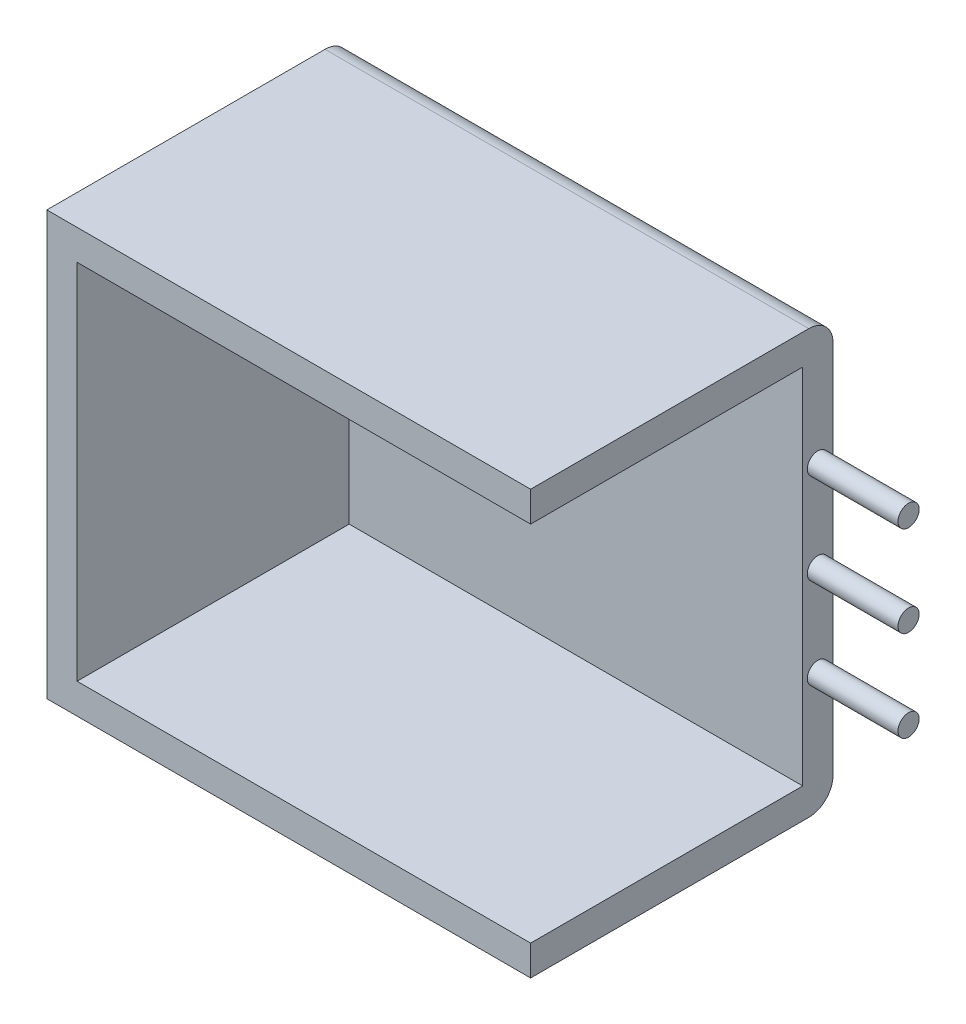
ISO-10303-21;
HEADER;
FILE_DESCRIPTION(('STEP AP214'),'2;1');
FILE_NAME('part.step','',(''),(''),'','','');
FILE_SCHEMA(('AUTOMOTIVE_DESIGN { 1 0 10303 214 1 1 1 1 }'));
ENDSEC;
DATA;
#1=APPLICATION_CONTEXT('core data for automotive mechanical design processes');
#2=APPLICATION_PROTOCOL_DEFINITION('international standard','automotive_design',2000,#1);
#3=PRODUCT_CONTEXT('',#1,'mechanical');
#4=PRODUCT('Part','Part','',(#3));
#5=PRODUCT_RELATED_PRODUCT_CATEGORY('part','',(#4));
#6=PRODUCT_DEFINITION_FORMATION('','',#4);
#7=PRODUCT_DEFINITION_CONTEXT('part definition',#1,'design');
#8=PRODUCT_DEFINITION('design','',#6,#7);
#9=PRODUCT_DEFINITION_SHAPE('','',#8);
#10=(LENGTH_UNIT() NAMED_UNIT(*) SI_UNIT(.MILLI.,.METRE.));
#11=(NAMED_UNIT(*) PLANE_ANGLE_UNIT() SI_UNIT($,.RADIAN.));
#12=(NAMED_UNIT(*) SI_UNIT($,.STERADIAN.) SOLID_ANGLE_UNIT());
#13=UNCERTAINTY_MEASURE_WITH_UNIT(LENGTH_MEASURE(1.E-05),#10,'distance_accuracy_value','');
#14=(GEOMETRIC_REPRESENTATION_CONTEXT(3) GLOBAL_UNCERTAINTY_ASSIGNED_CONTEXT((#13)) GLOBAL_UNIT_ASSIGNED_CONTEXT((#10,
#11,#12)) REPRESENTATION_CONTEXT('',''));
#15=CARTESIAN_POINT('',(0.,0.,0.));
#16=DIRECTION('',(0.,0.,1.));
#17=DIRECTION('',(1.,0.,0.));
#18=AXIS2_PLACEMENT_3D('',#15,#16,#17);
#19=CARTESIAN_POINT('',(0.,-59.9999999999997,10.));
#20=DIRECTION('',(-1.,0.,0.));
#21=DIRECTION('',(0.,0.,1.));
#22=AXIS2_PLACEMENT_3D('',#19,#20,#21);
#23=PLANE('',#22);
#24=CARTESIAN_POINT('',(0.,0.,5.));
#25=DIRECTION('',(-1.,0.,0.));
#26=DIRECTION('',(0.,0.,1.));
#27=AXIS2_PLACEMENT_3D('',#24,#25,#26);
#28=CIRCLE('',#27,3.5);
#29=CARTESIAN_POINT('',(0.,0.,8.5));
#30=VERTEX_POINT('',#29);
#31=EDGE_CURVE('E195',#30,#30,#28,.F.);
#32=ORIENTED_EDGE('',*,*,#31,.F.);
#33=EDGE_LOOP('',(#32));
#34=FACE_BOUND('',#33,.T.);
#35=CARTESIAN_POINT('',(0.,-30.,5.));
#36=DIRECTION('',(-1.,0.,0.));
#37=DIRECTION('',(0.,0.,1.));
#38=AXIS2_PLACEMENT_3D('',#35,#36,#37);
#39=CIRCLE('',#38,3.5);
#40=CARTESIAN_POINT('',(0.,-30.,8.5));
#41=VERTEX_POINT('',#40);
#42=EDGE_CURVE('E192',#41,#41,#39,.F.);
#43=ORIENTED_EDGE('',*,*,#42,.F.);
#44=EDGE_LOOP('',(#43));
#45=FACE_BOUND('',#44,.T.);
#46=CARTESIAN_POINT('',(0.,30.,5.));
#47=DIRECTION('',(-1.,0.,0.));
#48=DIRECTION('',(0.,0.,1.));
#49=AXIS2_PLACEMENT_3D('',#46,#47,#48);
#50=CIRCLE('',#49,3.5);
#51=CARTESIAN_POINT('',(0.,30.,8.5));
#52=VERTEX_POINT('',#51);
#53=EDGE_CURVE('E187',#52,#52,#50,.F.);
#54=ORIENTED_EDGE('',*,*,#53,.F.);
#55=EDGE_LOOP('',(#54));
#56=FACE_BOUND('',#55,.T.);
#57=DIRECTION('',(0.,0.,1.));
#58=VECTOR('',#57,1.);
#59=CARTESIAN_POINT('',(1.94289029309402E-13,-69.9999999999997,0.));
#60=LINE('',#59,#58);
#61=CARTESIAN_POINT('',(1.92819453150425E-13,-69.9999999999997,8.));
#62=VERTEX_POINT('',#61);
#63=CARTESIAN_POINT('',(1.75919327322191E-13,-69.9999999999997,100.));
#64=VERTEX_POINT('',#63);
#65=EDGE_CURVE('E148',#62,#64,#60,.T.);
#66=ORIENTED_EDGE('',*,*,#65,.F.);
#67=CARTESIAN_POINT('',(0.,-61.9999999999997,8.));
#68=DIRECTION('',(-1.,0.,0.));
#69=DIRECTION('',(0.,0.,1.));
#70=AXIS2_PLACEMENT_3D('',#67,#68,#69);
#71=CIRCLE('',#70,8.);
#72=CARTESIAN_POINT('',(0.,-61.9999999999997,0.));
#73=VERTEX_POINT('',#72);
#74=EDGE_CURVE('E203',#62,#73,#71,.F.);
#75=ORIENTED_EDGE('',*,*,#74,.T.);
#76=DIRECTION('',(0.,1.,0.));
#77=VECTOR('',#76,1.);
#78=CARTESIAN_POINT('',(0.,-59.9999999999997,0.));
#79=LINE('',#78,#77);
#80=CARTESIAN_POINT('',(0.,61.9999999999999,0.));
#81=VERTEX_POINT('',#80);
#82=EDGE_CURVE('E175',#73,#81,#79,.T.);
#83=ORIENTED_EDGE('',*,*,#82,.T.);
#84=CARTESIAN_POINT('',(0.,61.9999999999999,8.));
#85=DIRECTION('',(-1.,0.,0.));
#86=DIRECTION('',(0.,0.,1.));
#87=AXIS2_PLACEMENT_3D('',#84,#85,#86);
#88=CIRCLE('',#87,8.);
#89=CARTESIAN_POINT('',(0.,69.9999999999999,8.));
#90=VERTEX_POINT('',#89);
#91=EDGE_CURVE('E201',#81,#90,#88,.F.);
#92=ORIENTED_EDGE('',*,*,#91,.T.);
#93=DIRECTION('',(0.,0.,-1.));
#94=VECTOR('',#93,1.);
#95=CARTESIAN_POINT('',(0.,69.9999999999999,0.));
#96=LINE('',#95,#94);
#97=CARTESIAN_POINT('',(0.,69.9999999999999,100.));
#98=VERTEX_POINT('',#97);
#99=EDGE_CURVE('E137',#98,#90,#96,.T.);
#100=ORIENTED_EDGE('',*,*,#99,.F.);
#101=DIRECTION('',(0.,-1.,0.));
#102=VECTOR('',#101,1.);
#103=CARTESIAN_POINT('',(0.,69.9999999999999,100.));
#104=LINE('',#103,#102);
#105=CARTESIAN_POINT('',(0.,59.9999999999999,100.));
#106=VERTEX_POINT('',#105);
#107=EDGE_CURVE('E135',#98,#106,#104,.T.);
#108=ORIENTED_EDGE('',*,*,#107,.T.);
#109=DIRECTION('',(0.,0.,-1.));
#110=VECTOR('',#109,1.);
#111=CARTESIAN_POINT('',(0.,59.9999999999999,0.));
#112=LINE('',#111,#110);
#113=CARTESIAN_POINT('',(0.,59.9999999999999,10.));
#114=VERTEX_POINT('',#113);
#115=EDGE_CURVE('E119',#106,#114,#112,.T.);
#116=ORIENTED_EDGE('',*,*,#115,.T.);
#117=DIRECTION('',(0.,1.,0.));
#118=VECTOR('',#117,1.);
#119=CARTESIAN_POINT('',(0.,-59.9999999999997,10.));
#120=LINE('',#119,#118);
#121=CARTESIAN_POINT('',(0.,-59.9999999999997,10.));
#122=VERTEX_POINT('',#121);
#123=EDGE_CURVE('E176',#122,#114,#120,.T.);
#124=ORIENTED_EDGE('',*,*,#123,.F.);
#125=DIRECTION('',(0.,0.,1.));
#126=VECTOR('',#125,1.);
#127=CARTESIAN_POINT('',(1.66533453693773E-13,-59.9999999999997,0.));
#128=LINE('',#127,#126);
#129=CARTESIAN_POINT('',(1.48163751706562E-13,-59.9999999999997,100.));
#130=VERTEX_POINT('',#129);
#131=EDGE_CURVE('E146',#122,#130,#128,.T.);
#132=ORIENTED_EDGE('',*,*,#131,.T.);
#133=DIRECTION('',(0.,1.,0.));
#134=VECTOR('',#133,1.);
#135=CARTESIAN_POINT('',(1.75919327322191E-13,-69.9999999999997,100.));
#136=LINE('',#135,#134);
#137=EDGE_CURVE('E153',#64,#130,#136,.T.);
#138=ORIENTED_EDGE('',*,*,#137,.F.);
#139=EDGE_LOOP('',(#66,#75,#83,#92,#100,#108,#116,#124,#132,#138));
#140=FACE_BOUND('',#139,.T.);
#141=ADVANCED_FACE('F33',(#34,#45,#56,#140),#23,.F.);
#142=CARTESIAN_POINT('',(0.,0.,10.));
#143=DIRECTION('',(0.,0.,-1.));
#144=DIRECTION('',(-1.,0.,0.));
#145=AXIS2_PLACEMENT_3D('',#142,#143,#144);
#146=PLANE('',#145);
#147=ORIENTED_EDGE('',*,*,#123,.T.);
#148=DIRECTION('',(-1.,0.,0.));
#149=VECTOR('',#148,1.);
#150=CARTESIAN_POINT('',(-150.,59.9999999999999,10.));
#151=LINE('',#150,#149);
#152=CARTESIAN_POINT('',(-150.,59.9999999999999,10.));
#153=VERTEX_POINT('',#152);
#154=EDGE_CURVE('E179',#114,#153,#151,.T.);
#155=ORIENTED_EDGE('',*,*,#154,.T.);
#156=DIRECTION('',(0.,-1.,0.));
#157=VECTOR('',#156,1.);
#158=CARTESIAN_POINT('',(-150.,-60.0000000000001,10.));
#159=LINE('',#158,#157);
#160=CARTESIAN_POINT('',(-150.,-60.0000000000001,10.));
#161=VERTEX_POINT('',#160);
#162=EDGE_CURVE('E182',#153,#161,#159,.T.);
#163=ORIENTED_EDGE('',*,*,#162,.T.);
#164=DIRECTION('',(1.,0.,0.));
#165=VECTOR('',#164,1.);
#166=CARTESIAN_POINT('',(-150.,-60.0000000000001,10.));
#167=LINE('',#166,#165);
#168=EDGE_CURVE('E185',#161,#122,#167,.T.);
#169=ORIENTED_EDGE('',*,*,#168,.T.);
#170=EDGE_LOOP('',(#147,#155,#163,#169));
#171=FACE_BOUND('',#170,.T.);
#172=ADVANCED_FACE('F226',(#171),#146,.F.);
#173=CARTESIAN_POINT('',(0.,0.,0.));
#174=DIRECTION('',(0.,0.,-1.));
#175=DIRECTION('',(-1.,0.,0.));
#176=AXIS2_PLACEMENT_3D('',#173,#174,#175);
#177=PLANE('',#176);
#178=ORIENTED_EDGE('',*,*,#82,.F.);
#179=DIRECTION('',(1.,0.,0.));
#180=VECTOR('',#179,1.);
#181=CARTESIAN_POINT('',(-160.,-62.0000000000001,0.));
#182=LINE('',#181,#180);
#183=CARTESIAN_POINT('',(-160.,-62.0000000000001,0.));
#184=VERTEX_POINT('',#183);
#185=EDGE_CURVE('E55',#73,#184,#182,.F.);
#186=ORIENTED_EDGE('',*,*,#185,.T.);
#187=DIRECTION('',(0.,-1.,0.));
#188=VECTOR('',#187,1.);
#189=CARTESIAN_POINT('',(-160.,59.9999999999999,0.));
#190=LINE('',#189,#188);
#191=CARTESIAN_POINT('',(-160.,61.9999999999999,0.));
#192=VERTEX_POINT('',#191);
#193=EDGE_CURVE('E130',#192,#184,#190,.T.);
#194=ORIENTED_EDGE('',*,*,#193,.F.);
#195=DIRECTION('',(-1.,0.,0.));
#196=VECTOR('',#195,1.);
#197=CARTESIAN_POINT('',(0.,61.9999999999999,0.));
#198=LINE('',#197,#196);
#199=EDGE_CURVE('E205',#192,#81,#198,.F.);
#200=ORIENTED_EDGE('',*,*,#199,.T.);
#201=EDGE_LOOP('',(#178,#186,#194,#200));
#202=FACE_BOUND('',#201,.T.);
#203=ADVANCED_FACE('F218',(#202),#177,.T.);
#204=CARTESIAN_POINT('',(30.,30.,5.));
#205=DIRECTION('',(-1.,0.,0.));
#206=DIRECTION('',(0.,0.,1.));
#207=AXIS2_PLACEMENT_3D('',#204,#205,#206);
#208=CYLINDRICAL_SURFACE('',#207,3.5);
#209=CARTESIAN_POINT('',(30.,30.,5.));
#210=DIRECTION('',(1.,0.,0.));
#211=DIRECTION('',(0.,0.,-1.));
#212=AXIS2_PLACEMENT_3D('',#209,#210,#211);
#213=CIRCLE('',#212,3.5);
#214=CARTESIAN_POINT('',(30.,30.,1.5));
#215=VERTEX_POINT('',#214);
#216=EDGE_CURVE('E172',#215,#215,#213,.T.);
#217=ORIENTED_EDGE('',*,*,#216,.F.);
#218=EDGE_LOOP('',(#217));
#219=FACE_BOUND('',#218,.T.);
#220=ORIENTED_EDGE('',*,*,#53,.T.);
#221=EDGE_LOOP('',(#220));
#222=FACE_BOUND('',#221,.T.);
#223=ADVANCED_FACE('F327',(#219,#222),#208,.T.);
#224=CARTESIAN_POINT('',(30.,30.,5.));
#225=DIRECTION('',(1.,0.,0.));
#226=DIRECTION('',(0.,0.,-1.));
#227=AXIS2_PLACEMENT_3D('',#224,#225,#226);
#228=PLANE('',#227);
#229=ORIENTED_EDGE('',*,*,#216,.T.);
#230=EDGE_LOOP('',(#229));
#231=FACE_BOUND('',#230,.T.);
#232=ADVANCED_FACE('F390',(#231),#228,.T.);
#233=CARTESIAN_POINT('',(30.,-30.,5.));
#234=DIRECTION('',(-1.,0.,0.));
#235=DIRECTION('',(0.,0.,1.));
#236=AXIS2_PLACEMENT_3D('',#233,#234,#235);
#237=CYLINDRICAL_SURFACE('',#236,3.5);
#238=CARTESIAN_POINT('',(30.,-30.,5.));
#239=DIRECTION('',(1.,0.,0.));
#240=DIRECTION('',(0.,0.,-1.));
#241=AXIS2_PLACEMENT_3D('',#238,#239,#240);
#242=CIRCLE('',#241,3.5);
#243=CARTESIAN_POINT('',(30.,-30.,1.5));
#244=VERTEX_POINT('',#243);
#245=EDGE_CURVE('E169',#244,#244,#242,.T.);
#246=ORIENTED_EDGE('',*,*,#245,.F.);
#247=EDGE_LOOP('',(#246));
#248=FACE_BOUND('',#247,.T.);
#249=ORIENTED_EDGE('',*,*,#42,.T.);
#250=EDGE_LOOP('',(#249));
#251=FACE_BOUND('',#250,.T.);
#252=ADVANCED_FACE('F381',(#248,#251),#237,.T.);
#253=CARTESIAN_POINT('',(30.,-30.,5.));
#254=DIRECTION('',(1.,0.,0.));
#255=DIRECTION('',(0.,0.,-1.));
#256=AXIS2_PLACEMENT_3D('',#253,#254,#255);
#257=PLANE('',#256);
#258=ORIENTED_EDGE('',*,*,#245,.T.);
#259=EDGE_LOOP('',(#258));
#260=FACE_BOUND('',#259,.T.);
#261=ADVANCED_FACE('F372',(#260),#257,.T.);
#262=CARTESIAN_POINT('',(30.,0.,5.));
#263=DIRECTION('',(-1.,0.,0.));
#264=DIRECTION('',(0.,0.,1.));
#265=AXIS2_PLACEMENT_3D('',#262,#263,#264);
#266=CYLINDRICAL_SURFACE('',#265,3.5);
#267=CARTESIAN_POINT('',(30.,0.,5.));
#268=DIRECTION('',(1.,0.,0.));
#269=DIRECTION('',(0.,0.,-1.));
#270=AXIS2_PLACEMENT_3D('',#267,#268,#269);
#271=CIRCLE('',#270,3.5);
#272=CARTESIAN_POINT('',(30.,0.,1.5));
#273=VERTEX_POINT('',#272);
#274=EDGE_CURVE('E129',#273,#273,#271,.T.);
#275=ORIENTED_EDGE('',*,*,#274,.F.);
#276=EDGE_LOOP('',(#275));
#277=FACE_BOUND('',#276,.T.);
#278=ORIENTED_EDGE('',*,*,#31,.T.);
#279=EDGE_LOOP('',(#278));
#280=FACE_BOUND('',#279,.T.);
#281=ADVANCED_FACE('F242',(#277,#280),#266,.T.);
#282=CARTESIAN_POINT('',(30.,0.,5.));
#283=DIRECTION('',(1.,0.,0.));
#284=DIRECTION('',(0.,0.,-1.));
#285=AXIS2_PLACEMENT_3D('',#282,#283,#284);
#286=PLANE('',#285);
#287=ORIENTED_EDGE('',*,*,#274,.T.);
#288=EDGE_LOOP('',(#287));
#289=FACE_BOUND('',#288,.T.);
#290=ADVANCED_FACE('F235',(#289),#286,.T.);
#291=CARTESIAN_POINT('',(-150.,0.,0.));
#292=DIRECTION('',(1.,0.,0.));
#293=DIRECTION('',(0.,0.,-1.));
#294=AXIS2_PLACEMENT_3D('',#291,#292,#293);
#295=PLANE('',#294);
#296=ORIENTED_EDGE('',*,*,#162,.F.);
#297=DIRECTION('',(0.,0.,-1.));
#298=VECTOR('',#297,1.);
#299=CARTESIAN_POINT('',(-150.,59.9999999999999,0.));
#300=LINE('',#299,#298);
#301=CARTESIAN_POINT('',(-150.,59.9999999999999,100.));
#302=VERTEX_POINT('',#301);
#303=EDGE_CURVE('E159',#302,#153,#300,.T.);
#304=ORIENTED_EDGE('',*,*,#303,.F.);
#305=DIRECTION('',(0.,1.,0.));
#306=VECTOR('',#305,1.);
#307=CARTESIAN_POINT('',(-150.,59.9999999999999,100.));
#308=LINE('',#307,#306);
#309=CARTESIAN_POINT('',(-150.,-60.0000000000001,100.));
#310=VERTEX_POINT('',#309);
#311=EDGE_CURVE('E160',#310,#302,#308,.T.);
#312=ORIENTED_EDGE('',*,*,#311,.F.);
#313=DIRECTION('',(0.,0.,1.));
#314=VECTOR('',#313,1.);
#315=CARTESIAN_POINT('',(-150.,-60.0000000000001,0.));
#316=LINE('',#315,#314);
#317=EDGE_CURVE('E163',#161,#310,#316,.T.);
#318=ORIENTED_EDGE('',*,*,#317,.F.);
#319=EDGE_LOOP('',(#296,#304,#312,#318));
#320=FACE_BOUND('',#319,.T.);
#321=ADVANCED_FACE('F233',(#320),#295,.T.);
#322=CARTESIAN_POINT('',(-160.,59.9999999999999,100.));
#323=DIRECTION('',(0.,0.,-1.));
#324=DIRECTION('',(-1.,0.,0.));
#325=AXIS2_PLACEMENT_3D('',#322,#323,#324);
#326=PLANE('',#325);
#327=ORIENTED_EDGE('',*,*,#311,.T.);
#328=DIRECTION('',(1.,0.,0.));
#329=VECTOR('',#328,1.);
#330=CARTESIAN_POINT('',(-160.,59.9999999999999,100.));
#331=LINE('',#330,#329);
#332=EDGE_CURVE('E141',#302,#106,#331,.T.);
#333=ORIENTED_EDGE('',*,*,#332,.T.);
#334=ORIENTED_EDGE('',*,*,#107,.F.);
#335=DIRECTION('',(1.,0.,0.));
#336=VECTOR('',#335,1.);
#337=CARTESIAN_POINT('',(-160.,69.9999999999999,100.));
#338=LINE('',#337,#336);
#339=CARTESIAN_POINT('',(-160.,69.9999999999999,100.));
#340=VERTEX_POINT('',#339);
#341=EDGE_CURVE('E116',#340,#98,#338,.T.);
#342=ORIENTED_EDGE('',*,*,#341,.F.);
#343=DIRECTION('',(0.,1.,0.));
#344=VECTOR('',#343,1.);
#345=CARTESIAN_POINT('',(-160.,59.9999999999999,100.));
#346=LINE('',#345,#344);
#347=CARTESIAN_POINT('',(-160.,-70.0000000000001,100.));
#348=VERTEX_POINT('',#347);
#349=EDGE_CURVE('E122',#348,#340,#346,.T.);
#350=ORIENTED_EDGE('',*,*,#349,.F.);
#351=DIRECTION('',(-1.,0.,0.));
#352=VECTOR('',#351,1.);
#353=CARTESIAN_POINT('',(-160.,-70.0000000000001,100.));
#354=LINE('',#353,#352);
#355=EDGE_CURVE('E151',#64,#348,#354,.T.);
#356=ORIENTED_EDGE('',*,*,#355,.F.);
#357=ORIENTED_EDGE('',*,*,#137,.T.);
#358=DIRECTION('',(-1.,0.,0.));
#359=VECTOR('',#358,1.);
#360=CARTESIAN_POINT('',(-160.,-60.0000000000001,100.));
#361=LINE('',#360,#359);
#362=EDGE_CURVE('E149',#130,#310,#361,.T.);
#363=ORIENTED_EDGE('',*,*,#362,.T.);
#364=EDGE_LOOP('',(#327,#333,#334,#342,#350,#356,#357,#363));
#365=FACE_BOUND('',#364,.T.);
#366=ADVANCED_FACE('F133',(#365),#326,.F.);
#367=CARTESIAN_POINT('',(-160.,0.,0.));
#368=DIRECTION('',(1.,0.,0.));
#369=DIRECTION('',(0.,0.,-1.));
#370=AXIS2_PLACEMENT_3D('',#367,#368,#369);
#371=PLANE('',#370);
#372=ORIENTED_EDGE('',*,*,#193,.T.);
#373=CARTESIAN_POINT('',(-160.,-62.0000000000001,8.));
#374=DIRECTION('',(1.,0.,0.));
#375=DIRECTION('',(0.,0.,-1.));
#376=AXIS2_PLACEMENT_3D('',#373,#374,#375);
#377=CIRCLE('',#376,8.);
#378=CARTESIAN_POINT('',(-160.,-70.0000000000001,8.));
#379=VERTEX_POINT('',#378);
#380=EDGE_CURVE('E41',#184,#379,#377,.F.);
#381=ORIENTED_EDGE('',*,*,#380,.T.);
#382=DIRECTION('',(0.,0.,-1.));
#383=VECTOR('',#382,1.);
#384=CARTESIAN_POINT('',(-160.,-70.0000000000001,0.));
#385=LINE('',#384,#383);
#386=EDGE_CURVE('E125',#348,#379,#385,.T.);
#387=ORIENTED_EDGE('',*,*,#386,.F.);
#388=ORIENTED_EDGE('',*,*,#349,.T.);
#389=DIRECTION('',(0.,0.,1.));
#390=VECTOR('',#389,1.);
#391=CARTESIAN_POINT('',(-160.,69.9999999999999,0.));
#392=LINE('',#391,#390);
#393=CARTESIAN_POINT('',(-160.,69.9999999999999,8.));
#394=VERTEX_POINT('',#393);
#395=EDGE_CURVE('E111',#394,#340,#392,.T.);
#396=ORIENTED_EDGE('',*,*,#395,.F.);
#397=CARTESIAN_POINT('',(-160.,61.9999999999999,8.));
#398=DIRECTION('',(1.,0.,0.));
#399=DIRECTION('',(0.,0.,-1.));
#400=AXIS2_PLACEMENT_3D('',#397,#398,#399);
#401=CIRCLE('',#400,8.);
#402=EDGE_CURVE('E48',#394,#192,#401,.F.);
#403=ORIENTED_EDGE('',*,*,#402,.T.);
#404=EDGE_LOOP('',(#372,#381,#387,#388,#396,#403));
#405=FACE_BOUND('',#404,.T.);
#406=ADVANCED_FACE('F123',(#405),#371,.F.);
#407=CARTESIAN_POINT('',(1.66533453693772E-13,-59.9999999999997,0.));
#408=DIRECTION('',(0.,1.,0.));
#409=DIRECTION('',(-1.,0.,0.));
#410=AXIS2_PLACEMENT_3D('',#407,#408,#409);
#411=PLANE('',#410);
#412=ORIENTED_EDGE('',*,*,#168,.F.);
#413=ORIENTED_EDGE('',*,*,#317,.T.);
#414=ORIENTED_EDGE('',*,*,#362,.F.);
#415=ORIENTED_EDGE('',*,*,#131,.F.);
#416=EDGE_LOOP('',(#412,#413,#414,#415));
#417=FACE_BOUND('',#416,.T.);
#418=ADVANCED_FACE('F231',(#417),#411,.T.);
#419=CARTESIAN_POINT('',(1.94289029309401E-13,-69.9999999999997,0.));
#420=DIRECTION('',(0.,1.,0.));
#421=DIRECTION('',(-1.,0.,0.));
#422=AXIS2_PLACEMENT_3D('',#419,#420,#421);
#423=PLANE('',#422);
#424=ORIENTED_EDGE('',*,*,#386,.T.);
#425=DIRECTION('',(1.,0.,0.));
#426=VECTOR('',#425,1.);
#427=CARTESIAN_POINT('',(1.94289029309402E-13,-69.9999999999997,8.));
#428=LINE('',#427,#426);
#429=EDGE_CURVE('E198',#379,#62,#428,.T.);
#430=ORIENTED_EDGE('',*,*,#429,.T.);
#431=ORIENTED_EDGE('',*,*,#65,.T.);
#432=ORIENTED_EDGE('',*,*,#355,.T.);
#433=EDGE_LOOP('',(#424,#430,#431,#432));
#434=FACE_BOUND('',#433,.T.);
#435=ADVANCED_FACE('F212',(#434),#423,.F.);
#436=CARTESIAN_POINT('',(0.,59.9999999999999,0.));
#437=DIRECTION('',(0.,1.,0.));
#438=DIRECTION('',(-1.,0.,0.));
#439=AXIS2_PLACEMENT_3D('',#436,#437,#438);
#440=PLANE('',#439);
#441=ORIENTED_EDGE('',*,*,#332,.F.);
#442=ORIENTED_EDGE('',*,*,#303,.T.);
#443=ORIENTED_EDGE('',*,*,#154,.F.);
#444=ORIENTED_EDGE('',*,*,#115,.F.);
#445=EDGE_LOOP('',(#441,#442,#443,#444));
#446=FACE_BOUND('',#445,.T.);
#447=ADVANCED_FACE('F222',(#446),#440,.F.);
#448=CARTESIAN_POINT('',(0.,69.9999999999999,0.));
#449=DIRECTION('',(0.,1.,0.));
#450=DIRECTION('',(-1.,0.,0.));
#451=AXIS2_PLACEMENT_3D('',#448,#449,#450);
#452=PLANE('',#451);
#453=ORIENTED_EDGE('',*,*,#99,.T.);
#454=DIRECTION('',(-1.,0.,0.));
#455=VECTOR('',#454,1.);
#456=CARTESIAN_POINT('',(0.,69.9999999999999,8.));
#457=LINE('',#456,#455);
#458=EDGE_CURVE('E11',#90,#394,#457,.T.);
#459=ORIENTED_EDGE('',*,*,#458,.T.);
#460=ORIENTED_EDGE('',*,*,#395,.T.);
#461=ORIENTED_EDGE('',*,*,#341,.T.);
#462=EDGE_LOOP('',(#453,#459,#460,#461));
#463=FACE_BOUND('',#462,.T.);
#464=ADVANCED_FACE('F114',(#463),#452,.T.);
#465=CARTESIAN_POINT('',(1.72084568816898E-13,-61.9999999999997,8.));
#466=DIRECTION('',(-1.,0.,0.));
#467=DIRECTION('',(0.,-1.,0.));
#468=AXIS2_PLACEMENT_3D('',#465,#466,#467);
#469=CYLINDRICAL_SURFACE('',#468,8.);
#470=ORIENTED_EDGE('',*,*,#380,.F.);
#471=ORIENTED_EDGE('',*,*,#185,.F.);
#472=ORIENTED_EDGE('',*,*,#74,.F.);
#473=ORIENTED_EDGE('',*,*,#429,.F.);
#474=EDGE_LOOP('',(#470,#471,#472,#473));
#475=FACE_BOUND('',#474,.T.);
#476=ADVANCED_FACE('F214',(#475),#469,.T.);
#477=CARTESIAN_POINT('',(0.,61.9999999999999,8.));
#478=DIRECTION('',(-1.,0.,0.));
#479=DIRECTION('',(0.,-1.,0.));
#480=AXIS2_PLACEMENT_3D('',#477,#478,#479);
#481=CYLINDRICAL_SURFACE('',#480,8.);
#482=ORIENTED_EDGE('',*,*,#91,.F.);
#483=ORIENTED_EDGE('',*,*,#199,.F.);
#484=ORIENTED_EDGE('',*,*,#402,.F.);
#485=ORIENTED_EDGE('',*,*,#458,.F.);
#486=EDGE_LOOP('',(#482,#483,#484,#485));
#487=FACE_BOUND('',#486,.T.);
#488=ADVANCED_FACE('F35',(#487),#481,.T.);
#489=CLOSED_SHELL('',(#141,#172,#203,#223,#232,#252,#261,#281,#290,#321,#366,#406,#418,#435,
#447,#464,#476,#488));
#490=MANIFOLD_SOLID_BREP('B2',#489);
#491=ADVANCED_BREP_SHAPE_REPRESENTATION('',(#18,#490),#14);
#492=SHAPE_DEFINITION_REPRESENTATION(#9,#491);
ENDSEC;
END-ISO-10303-21;
